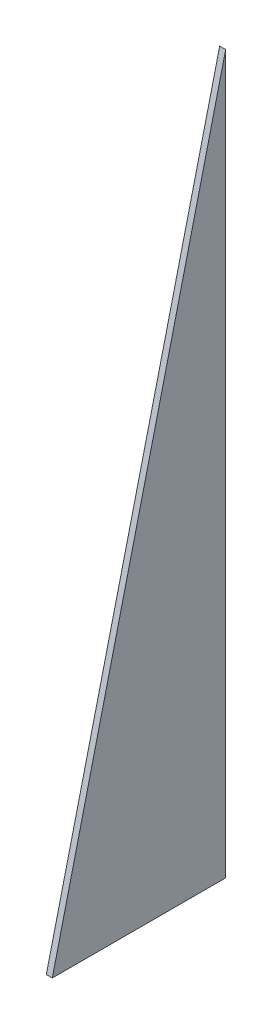
ISO-10303-21;
HEADER;
FILE_DESCRIPTION(('STEP AP214'),'2;1');
FILE_NAME('part.step','',(''),(''),'','','');
FILE_SCHEMA(('AUTOMOTIVE_DESIGN { 1 0 10303 214 1 1 1 1 }'));
ENDSEC;
DATA;
#1=APPLICATION_CONTEXT('core data for automotive mechanical design processes');
#2=APPLICATION_PROTOCOL_DEFINITION('international standard','automotive_design',2000,#1);
#3=PRODUCT_CONTEXT('',#1,'mechanical');
#4=PRODUCT('Part','Part','',(#3));
#5=PRODUCT_RELATED_PRODUCT_CATEGORY('part','',(#4));
#6=PRODUCT_DEFINITION_FORMATION('','',#4);
#7=PRODUCT_DEFINITION_CONTEXT('part definition',#1,'design');
#8=PRODUCT_DEFINITION('design','',#6,#7);
#9=PRODUCT_DEFINITION_SHAPE('','',#8);
#10=(LENGTH_UNIT() NAMED_UNIT(*) SI_UNIT(.MILLI.,.METRE.));
#11=(NAMED_UNIT(*) PLANE_ANGLE_UNIT() SI_UNIT($,.RADIAN.));
#12=(NAMED_UNIT(*) SI_UNIT($,.STERADIAN.) SOLID_ANGLE_UNIT());
#13=UNCERTAINTY_MEASURE_WITH_UNIT(LENGTH_MEASURE(1.E-05),#10,'distance_accuracy_value','');
#14=(GEOMETRIC_REPRESENTATION_CONTEXT(3) GLOBAL_UNCERTAINTY_ASSIGNED_CONTEXT((#13)) GLOBAL_UNIT_ASSIGNED_CONTEXT((#10,
#11,#12)) REPRESENTATION_CONTEXT('',''));
#15=CARTESIAN_POINT('',(0.,0.,0.));
#16=DIRECTION('',(0.,0.,1.));
#17=DIRECTION('',(1.,0.,0.));
#18=AXIS2_PLACEMENT_3D('',#15,#16,#17);
#19=CARTESIAN_POINT('',(5.,-300.,0.));
#20=DIRECTION('',(0.,-1.,0.));
#21=DIRECTION('',(0.,0.,-1.));
#22=AXIS2_PLACEMENT_3D('',#19,#20,#21);
#23=PLANE('',#22);
#24=DIRECTION('',(0.,0.,1.));
#25=VECTOR('',#24,1.);
#26=CARTESIAN_POINT('',(0.,-300.,0.));
#27=LINE('',#26,#25);
#28=CARTESIAN_POINT('',(0.,-300.,-72.5));
#29=VERTEX_POINT('',#28);
#30=CARTESIAN_POINT('',(0.,-300.,72.5));
#31=VERTEX_POINT('',#30);
#32=EDGE_CURVE('E73',#29,#31,#27,.T.);
#33=ORIENTED_EDGE('',*,*,#32,.F.);
#34=DIRECTION('',(-1.,0.,0.));
#35=VECTOR('',#34,1.);
#36=CARTESIAN_POINT('',(5.,-300.,-72.5));
#37=LINE('',#36,#35);
#38=CARTESIAN_POINT('',(5.,-300.,-72.5));
#39=VERTEX_POINT('',#38);
#40=EDGE_CURVE('E11',#39,#29,#37,.T.);
#41=ORIENTED_EDGE('',*,*,#40,.F.);
#42=DIRECTION('',(0.,0.,1.));
#43=VECTOR('',#42,1.);
#44=CARTESIAN_POINT('',(5.,-300.,0.));
#45=LINE('',#44,#43);
#46=CARTESIAN_POINT('',(5.,-300.,72.5));
#47=VERTEX_POINT('',#46);
#48=EDGE_CURVE('E71',#39,#47,#45,.T.);
#49=ORIENTED_EDGE('',*,*,#48,.T.);
#50=DIRECTION('',(-1.,0.,0.));
#51=VECTOR('',#50,1.);
#52=CARTESIAN_POINT('',(5.,-300.,72.5));
#53=LINE('',#52,#51);
#54=EDGE_CURVE('E67',#47,#31,#53,.T.);
#55=ORIENTED_EDGE('',*,*,#54,.T.);
#56=EDGE_LOOP('',(#33,#41,#49,#55));
#57=FACE_BOUND('',#56,.T.);
#58=ADVANCED_FACE('F33',(#57),#23,.T.);
#59=CARTESIAN_POINT('',(5.,0.,-72.5));
#60=DIRECTION('',(0.,0.,1.));
#61=DIRECTION('',(1.,0.,0.));
#62=AXIS2_PLACEMENT_3D('',#59,#60,#61);
#63=PLANE('',#62);
#64=DIRECTION('',(0.,1.,0.));
#65=VECTOR('',#64,1.);
#66=CARTESIAN_POINT('',(0.,0.,-72.5));
#67=LINE('',#66,#65);
#68=CARTESIAN_POINT('',(0.,300.,-72.5));
#69=VERTEX_POINT('',#68);
#70=EDGE_CURVE('E61',#29,#69,#67,.T.);
#71=ORIENTED_EDGE('',*,*,#70,.T.);
#72=DIRECTION('',(-1.,0.,0.));
#73=VECTOR('',#72,1.);
#74=CARTESIAN_POINT('',(5.,300.,-72.5));
#75=LINE('',#74,#73);
#76=CARTESIAN_POINT('',(5.,300.,-72.5));
#77=VERTEX_POINT('',#76);
#78=EDGE_CURVE('E41',#77,#69,#75,.T.);
#79=ORIENTED_EDGE('',*,*,#78,.F.);
#80=DIRECTION('',(0.,1.,0.));
#81=VECTOR('',#80,1.);
#82=CARTESIAN_POINT('',(5.,0.,-72.5));
#83=LINE('',#82,#81);
#84=EDGE_CURVE('E74',#39,#77,#83,.T.);
#85=ORIENTED_EDGE('',*,*,#84,.F.);
#86=ORIENTED_EDGE('',*,*,#40,.T.);
#87=EDGE_LOOP('',(#71,#79,#85,#86));
#88=FACE_BOUND('',#87,.T.);
#89=ADVANCED_FACE('F75',(#88),#63,.F.);
#90=CARTESIAN_POINT('',(5.,0.,0.));
#91=DIRECTION('',(0.,-0.234904462052636,-0.972018463666078));
#92=DIRECTION('',(0.,0.972018463666078,-0.234904462052636));
#93=AXIS2_PLACEMENT_3D('',#90,#91,#92);
#94=PLANE('',#93);
#95=DIRECTION('',(0.,-0.972018463666078,0.234904462052636));
#96=VECTOR('',#95,1.);
#97=CARTESIAN_POINT('',(0.,0.,0.));
#98=LINE('',#97,#96);
#99=EDGE_CURVE('E78',#69,#31,#98,.T.);
#100=ORIENTED_EDGE('',*,*,#99,.T.);
#101=ORIENTED_EDGE('',*,*,#54,.F.);
#102=DIRECTION('',(0.,-0.972018463666078,0.234904462052636));
#103=VECTOR('',#102,1.);
#104=CARTESIAN_POINT('',(5.,0.,0.));
#105=LINE('',#104,#103);
#106=EDGE_CURVE('E49',#77,#47,#105,.T.);
#107=ORIENTED_EDGE('',*,*,#106,.F.);
#108=ORIENTED_EDGE('',*,*,#78,.T.);
#109=EDGE_LOOP('',(#100,#101,#107,#108));
#110=FACE_BOUND('',#109,.T.);
#111=ADVANCED_FACE('F87',(#110),#94,.F.);
#112=CARTESIAN_POINT('',(5.,0.,0.));
#113=DIRECTION('',(1.,0.,0.));
#114=DIRECTION('',(0.,0.,-1.));
#115=AXIS2_PLACEMENT_3D('',#112,#113,#114);
#116=PLANE('',#115);
#117=ORIENTED_EDGE('',*,*,#48,.F.);
#118=ORIENTED_EDGE('',*,*,#84,.T.);
#119=ORIENTED_EDGE('',*,*,#106,.T.);
#120=EDGE_LOOP('',(#117,#118,#119));
#121=FACE_BOUND('',#120,.T.);
#122=ADVANCED_FACE('F77',(#121),#116,.T.);
#123=CARTESIAN_POINT('',(0.,0.,0.));
#124=DIRECTION('',(1.,0.,0.));
#125=DIRECTION('',(0.,0.,-1.));
#126=AXIS2_PLACEMENT_3D('',#123,#124,#125);
#127=PLANE('',#126);
#128=ORIENTED_EDGE('',*,*,#32,.T.);
#129=ORIENTED_EDGE('',*,*,#99,.F.);
#130=ORIENTED_EDGE('',*,*,#70,.F.);
#131=EDGE_LOOP('',(#128,#129,#130));
#132=FACE_BOUND('',#131,.T.);
#133=ADVANCED_FACE('F89',(#132),#127,.F.);
#134=CLOSED_SHELL('',(#58,#89,#111,#122,#133));
#135=MANIFOLD_SOLID_BREP('B2',#134);
#136=ADVANCED_BREP_SHAPE_REPRESENTATION('',(#18,#135),#14);
#137=SHAPE_DEFINITION_REPRESENTATION(#9,#136);
ENDSEC;
END-ISO-10303-21;
